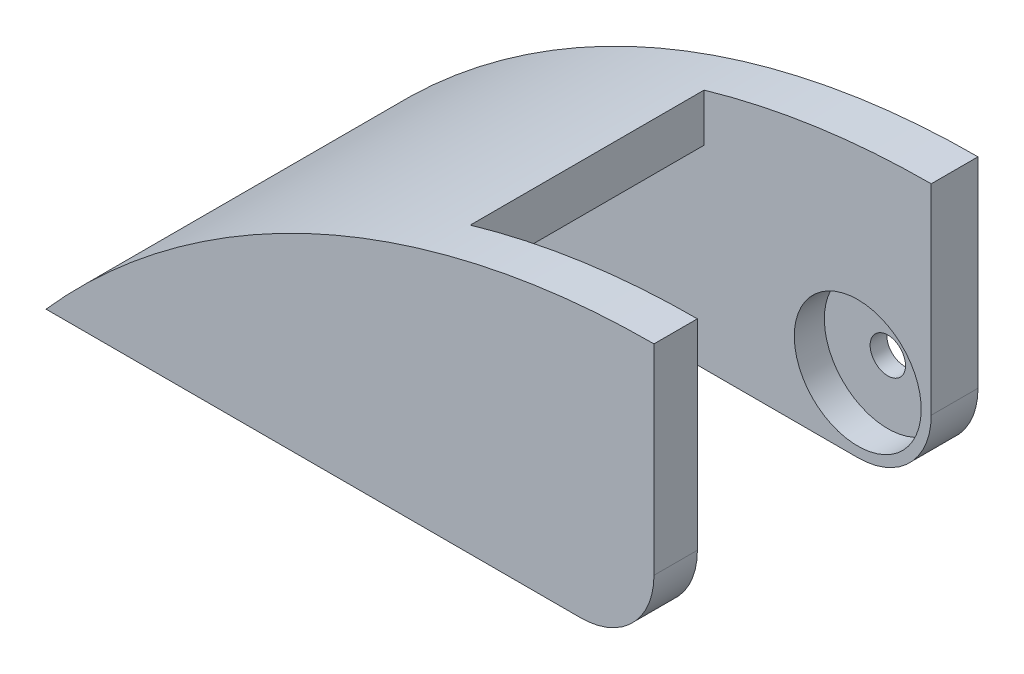
ISO-10303-21;
HEADER;
FILE_DESCRIPTION(('STEP AP214'),'2;1');
FILE_NAME('part.step','',(''),(''),'','','');
FILE_SCHEMA(('AUTOMOTIVE_DESIGN { 1 0 10303 214 1 1 1 1 }'));
ENDSEC;
DATA;
#1=APPLICATION_CONTEXT('core data for automotive mechanical design processes');
#2=APPLICATION_PROTOCOL_DEFINITION('international standard','automotive_design',2000,#1);
#3=PRODUCT_CONTEXT('',#1,'mechanical');
#4=PRODUCT('Part','Part','',(#3));
#5=PRODUCT_RELATED_PRODUCT_CATEGORY('part','',(#4));
#6=PRODUCT_DEFINITION_FORMATION('','',#4);
#7=PRODUCT_DEFINITION_CONTEXT('part definition',#1,'design');
#8=PRODUCT_DEFINITION('design','',#6,#7);
#9=PRODUCT_DEFINITION_SHAPE('','',#8);
#10=(LENGTH_UNIT() NAMED_UNIT(*) SI_UNIT(.MILLI.,.METRE.));
#11=(NAMED_UNIT(*) PLANE_ANGLE_UNIT() SI_UNIT($,.RADIAN.));
#12=(NAMED_UNIT(*) SI_UNIT($,.STERADIAN.) SOLID_ANGLE_UNIT());
#13=UNCERTAINTY_MEASURE_WITH_UNIT(LENGTH_MEASURE(1.E-05),#10,'distance_accuracy_value','');
#14=(GEOMETRIC_REPRESENTATION_CONTEXT(3) GLOBAL_UNCERTAINTY_ASSIGNED_CONTEXT((#13)) GLOBAL_UNIT_ASSIGNED_CONTEXT((#10,
#11,#12)) REPRESENTATION_CONTEXT('',''));
#15=CARTESIAN_POINT('',(0.,0.,0.));
#16=DIRECTION('',(0.,0.,1.));
#17=DIRECTION('',(1.,0.,0.));
#18=AXIS2_PLACEMENT_3D('',#15,#16,#17);
#19=CARTESIAN_POINT('',(0.,0.,-48.5));
#20=DIRECTION('',(0.,0.,-1.));
#21=DIRECTION('',(1.,0.,0.));
#22=AXIS2_PLACEMENT_3D('',#19,#20,#21);
#23=CYLINDRICAL_SURFACE('',#22,11.);
#24=DIRECTION('',(0.,0.,-1.));
#25=VECTOR('',#24,1.);
#26=CARTESIAN_POINT('',(11.,0.,-48.5));
#27=LINE('',#26,#25);
#28=CARTESIAN_POINT('',(11.,0.,-48.5));
#29=VERTEX_POINT('',#28);
#30=CARTESIAN_POINT('',(11.,0.,-55.));
#31=VERTEX_POINT('',#30);
#32=EDGE_CURVE('E161',#29,#31,#27,.T.);
#33=ORIENTED_EDGE('',*,*,#32,.F.);
#34=CARTESIAN_POINT('',(0.,0.,-48.5));
#35=DIRECTION('',(0.,0.,1.));
#36=DIRECTION('',(1.,0.,0.));
#37=AXIS2_PLACEMENT_3D('',#34,#35,#36);
#38=CIRCLE('',#37,11.);
#39=CARTESIAN_POINT('',(0.,-11.,-48.5));
#40=VERTEX_POINT('',#39);
#41=EDGE_CURVE('E233',#40,#29,#38,.T.);
#42=ORIENTED_EDGE('',*,*,#41,.F.);
#43=DIRECTION('',(0.,0.,1.));
#44=VECTOR('',#43,1.);
#45=CARTESIAN_POINT('',(0.,-11.,-55.5));
#46=LINE('',#45,#44);
#47=CARTESIAN_POINT('',(0.,-11.,-55.));
#48=VERTEX_POINT('',#47);
#49=EDGE_CURVE('E205',#48,#40,#46,.T.);
#50=ORIENTED_EDGE('',*,*,#49,.F.);
#51=CARTESIAN_POINT('',(0.,0.,-55.));
#52=DIRECTION('',(0.,0.,1.));
#53=DIRECTION('',(1.,0.,0.));
#54=AXIS2_PLACEMENT_3D('',#51,#52,#53);
#55=CIRCLE('',#54,11.);
#56=EDGE_CURVE('E177',#48,#31,#55,.T.);
#57=ORIENTED_EDGE('',*,*,#56,.T.);
#58=EDGE_LOOP('',(#33,#42,#50,#57));
#59=FACE_BOUND('',#58,.T.);
#60=ADVANCED_FACE('F49',(#59),#23,.T.);
#61=CARTESIAN_POINT('',(11.,0.,-48.5));
#62=DIRECTION('',(-1.,0.,0.));
#63=DIRECTION('',(0.,0.,-1.));
#64=AXIS2_PLACEMENT_3D('',#61,#62,#63);
#65=PLANE('',#64);
#66=DIRECTION('',(0.,1.,0.));
#67=VECTOR('',#66,1.);
#68=CARTESIAN_POINT('',(11.,0.,-55.));
#69=LINE('',#68,#67);
#70=CARTESIAN_POINT('',(11.,30.,-55.));
#71=VERTEX_POINT('',#70);
#72=EDGE_CURVE('E140',#31,#71,#69,.T.);
#73=ORIENTED_EDGE('',*,*,#72,.T.);
#74=DIRECTION('',(0.,0.,-1.));
#75=VECTOR('',#74,1.);
#76=CARTESIAN_POINT('',(11.,30.,-48.5));
#77=LINE('',#76,#75);
#78=CARTESIAN_POINT('',(11.,30.,-48.5));
#79=VERTEX_POINT('',#78);
#80=EDGE_CURVE('E149',#79,#71,#77,.T.);
#81=ORIENTED_EDGE('',*,*,#80,.F.);
#82=DIRECTION('',(0.,-1.,0.));
#83=VECTOR('',#82,1.);
#84=CARTESIAN_POINT('',(11.,0.,-48.5));
#85=LINE('',#84,#83);
#86=EDGE_CURVE('E230',#79,#29,#85,.T.);
#87=ORIENTED_EDGE('',*,*,#86,.T.);
#88=ORIENTED_EDGE('',*,*,#32,.T.);
#89=EDGE_LOOP('',(#73,#81,#87,#88));
#90=FACE_BOUND('',#89,.T.);
#91=ADVANCED_FACE('F159',(#90),#65,.F.);
#92=CARTESIAN_POINT('',(12.,-12.,-90.));
#93=DIRECTION('',(0.,0.,-1.));
#94=DIRECTION('',(0.,-1.,0.));
#95=AXIS2_PLACEMENT_3D('',#92,#93,#94);
#96=PLANE('',#95);
#97=CARTESIAN_POINT('',(0.,0.,-90.));
#98=DIRECTION('',(0.,0.,-1.));
#99=DIRECTION('',(0.,1.,0.));
#100=AXIS2_PLACEMENT_3D('',#97,#98,#99);
#101=CIRCLE('',#100,9.5);
#102=CARTESIAN_POINT('',(0.,9.5,-90.));
#103=VERTEX_POINT('',#102);
#104=EDGE_CURVE('E58',#103,#103,#101,.T.);
#105=ORIENTED_EDGE('',*,*,#104,.T.);
#106=EDGE_LOOP('',(#105));
#107=FACE_BOUND('',#106,.T.);
#108=CARTESIAN_POINT('',(11.,-91.4878048780488,-90.));
#109=DIRECTION('',(0.,0.,1.));
#110=DIRECTION('',(0.,-1.,0.));
#111=AXIS2_PLACEMENT_3D('',#108,#109,#110);
#112=CIRCLE('',#111,118.487804878049);
#113=CARTESIAN_POINT('',(-34.2965836217796,18.,-90.));
#114=VERTEX_POINT('',#113);
#115=CARTESIAN_POINT('',(-75.954431576152,-11.,-90.));
#116=VERTEX_POINT('',#115);
#117=EDGE_CURVE('E190',#114,#116,#112,.T.);
#118=ORIENTED_EDGE('',*,*,#117,.T.);
#119=DIRECTION('',(-1.,0.,0.));
#120=VECTOR('',#119,1.);
#121=CARTESIAN_POINT('',(0.,-11.,-90.));
#122=LINE('',#121,#120);
#123=CARTESIAN_POINT('',(0.,-11.,-90.));
#124=VERTEX_POINT('',#123);
#125=EDGE_CURVE('E209',#124,#116,#122,.T.);
#126=ORIENTED_EDGE('',*,*,#125,.F.);
#127=CARTESIAN_POINT('',(0.,0.,-90.));
#128=DIRECTION('',(0.,0.,1.));
#129=DIRECTION('',(0.,-1.,0.));
#130=AXIS2_PLACEMENT_3D('',#127,#128,#129);
#131=CIRCLE('',#130,11.);
#132=CARTESIAN_POINT('',(11.,0.,-90.));
#133=VERTEX_POINT('',#132);
#134=EDGE_CURVE('E155',#124,#133,#131,.T.);
#135=ORIENTED_EDGE('',*,*,#134,.T.);
#136=DIRECTION('',(0.,-1.,0.));
#137=VECTOR('',#136,1.);
#138=CARTESIAN_POINT('',(11.,-12.,-90.));
#139=LINE('',#138,#137);
#140=CARTESIAN_POINT('',(11.,30.,-90.));
#141=VERTEX_POINT('',#140);
#142=EDGE_CURVE('E248',#141,#133,#139,.T.);
#143=ORIENTED_EDGE('',*,*,#142,.F.);
#144=CARTESIAN_POINT('',(11.0000000000003,-91.4878048780494,-90.));
#145=DIRECTION('',(0.,0.,1.));
#146=DIRECTION('',(0.,-1.,0.));
#147=AXIS2_PLACEMENT_3D('',#144,#145,#146);
#148=CIRCLE('',#147,121.487804878049);
#149=CARTESIAN_POINT('',(-23.,25.1453239237065,-90.));
#150=VERTEX_POINT('',#149);
#151=EDGE_CURVE('E197',#150,#141,#148,.F.);
#152=ORIENTED_EDGE('',*,*,#151,.F.);
#153=DIRECTION('',(0.,1.,0.));
#154=VECTOR('',#153,1.);
#155=CARTESIAN_POINT('',(-23.,15.5,-90.));
#156=LINE('',#155,#154);
#157=CARTESIAN_POINT('',(-23.,18.,-90.));
#158=VERTEX_POINT('',#157);
#159=EDGE_CURVE('E252',#158,#150,#156,.T.);
#160=ORIENTED_EDGE('',*,*,#159,.F.);
#161=DIRECTION('',(1.,0.,0.));
#162=VECTOR('',#161,1.);
#163=CARTESIAN_POINT('',(0.,18.,-90.));
#164=LINE('',#163,#162);
#165=EDGE_CURVE('E213',#114,#158,#164,.T.);
#166=ORIENTED_EDGE('',*,*,#165,.F.);
#167=EDGE_LOOP('',(#118,#126,#135,#143,#152,#160,#166));
#168=FACE_BOUND('',#167,.T.);
#169=ADVANCED_FACE('F297',(#107,#168),#96,.F.);
#170=CARTESIAN_POINT('',(12.,18.,-90.));
#171=DIRECTION('',(0.,1.,0.));
#172=DIRECTION('',(0.,0.,-1.));
#173=AXIS2_PLACEMENT_3D('',#170,#171,#172);
#174=PLANE('',#173);
#175=DIRECTION('',(0.,0.,-1.));
#176=VECTOR('',#175,1.);
#177=CARTESIAN_POINT('',(-34.2965836217796,18.,-55.5));
#178=LINE('',#177,#176);
#179=CARTESIAN_POINT('',(-34.2965836217796,18.,-55.));
#180=VERTEX_POINT('',#179);
#181=EDGE_CURVE('E187',#180,#114,#178,.T.);
#182=ORIENTED_EDGE('',*,*,#181,.T.);
#183=ORIENTED_EDGE('',*,*,#165,.T.);
#184=DIRECTION('',(0.,0.,-1.));
#185=VECTOR('',#184,1.);
#186=CARTESIAN_POINT('',(-23.,18.,-90.));
#187=LINE('',#186,#185);
#188=CARTESIAN_POINT('',(-23.,18.,-55.));
#189=VERTEX_POINT('',#188);
#190=EDGE_CURVE('E11',#189,#158,#187,.T.);
#191=ORIENTED_EDGE('',*,*,#190,.F.);
#192=DIRECTION('',(-1.,0.,0.));
#193=VECTOR('',#192,1.);
#194=CARTESIAN_POINT('',(0.,18.,-55.));
#195=LINE('',#194,#193);
#196=EDGE_CURVE('E167',#189,#180,#195,.T.);
#197=ORIENTED_EDGE('',*,*,#196,.T.);
#198=EDGE_LOOP('',(#182,#183,#191,#197));
#199=FACE_BOUND('',#198,.T.);
#200=ADVANCED_FACE('F320',(#199),#174,.F.);
#201=CARTESIAN_POINT('',(0.,0.,-97.));
#202=DIRECTION('',(0.,0.,-1.));
#203=DIRECTION('',(1.,0.,0.));
#204=AXIS2_PLACEMENT_3D('',#201,#202,#203);
#205=PLANE('',#204);
#206=CARTESIAN_POINT('',(11.,-91.4878048780488,-97.));
#207=DIRECTION('',(0.,0.,1.));
#208=DIRECTION('',(1.,0.,0.));
#209=AXIS2_PLACEMENT_3D('',#206,#207,#208);
#210=CIRCLE('',#209,121.487804878049);
#211=CARTESIAN_POINT('',(-80.,-11.,-97.));
#212=VERTEX_POINT('',#211);
#213=CARTESIAN_POINT('',(11.,30.,-97.));
#214=VERTEX_POINT('',#213);
#215=EDGE_CURVE('E208',#212,#214,#210,.F.);
#216=ORIENTED_EDGE('',*,*,#215,.T.);
#217=DIRECTION('',(0.,-1.,0.));
#218=VECTOR('',#217,1.);
#219=CARTESIAN_POINT('',(11.,0.,-97.));
#220=LINE('',#219,#218);
#221=CARTESIAN_POINT('',(11.,0.,-97.));
#222=VERTEX_POINT('',#221);
#223=EDGE_CURVE('E227',#214,#222,#220,.T.);
#224=ORIENTED_EDGE('',*,*,#223,.T.);
#225=CARTESIAN_POINT('',(0.,0.,-97.));
#226=DIRECTION('',(0.,0.,1.));
#227=DIRECTION('',(1.,0.,0.));
#228=AXIS2_PLACEMENT_3D('',#225,#226,#227);
#229=CIRCLE('',#228,11.);
#230=CARTESIAN_POINT('',(0.,-11.,-97.));
#231=VERTEX_POINT('',#230);
#232=EDGE_CURVE('E234',#231,#222,#229,.T.);
#233=ORIENTED_EDGE('',*,*,#232,.F.);
#234=DIRECTION('',(-1.,0.,0.));
#235=VECTOR('',#234,1.);
#236=CARTESIAN_POINT('',(0.,-11.,-97.));
#237=LINE('',#236,#235);
#238=EDGE_CURVE('E214',#231,#212,#237,.T.);
#239=ORIENTED_EDGE('',*,*,#238,.T.);
#240=EDGE_LOOP('',(#216,#224,#233,#239));
#241=FACE_BOUND('',#240,.T.);
#242=CARTESIAN_POINT('',(0.,0.,-97.));
#243=DIRECTION('',(0.,0.,1.));
#244=DIRECTION('',(1.,0.,0.));
#245=AXIS2_PLACEMENT_3D('',#242,#243,#244);
#246=CIRCLE('',#245,2.65);
#247=CARTESIAN_POINT('',(2.65,0.,-97.));
#248=VERTEX_POINT('',#247);
#249=EDGE_CURVE('E260',#248,#248,#246,.T.);
#250=ORIENTED_EDGE('',*,*,#249,.T.);
#251=EDGE_LOOP('',(#250));
#252=FACE_BOUND('',#251,.T.);
#253=ADVANCED_FACE('F305',(#241,#252),#205,.T.);
#254=CARTESIAN_POINT('',(0.,0.,-48.5));
#255=DIRECTION('',(0.,0.,1.));
#256=DIRECTION('',(-1.,0.,0.));
#257=AXIS2_PLACEMENT_3D('',#254,#255,#256);
#258=PLANE('',#257);
#259=CARTESIAN_POINT('',(11.,-91.4878048780488,-48.5));
#260=DIRECTION('',(0.,0.,1.));
#261=DIRECTION('',(1.,0.,0.));
#262=AXIS2_PLACEMENT_3D('',#259,#260,#261);
#263=CIRCLE('',#262,121.487804878049);
#264=CARTESIAN_POINT('',(-80.,-11.,-48.5));
#265=VERTEX_POINT('',#264);
#266=EDGE_CURVE('E151',#265,#79,#263,.F.);
#267=ORIENTED_EDGE('',*,*,#266,.F.);
#268=DIRECTION('',(-1.,0.,0.));
#269=VECTOR('',#268,1.);
#270=CARTESIAN_POINT('',(0.,-11.,-48.5));
#271=LINE('',#270,#269);
#272=EDGE_CURVE('E65',#40,#265,#271,.T.);
#273=ORIENTED_EDGE('',*,*,#272,.F.);
#274=ORIENTED_EDGE('',*,*,#41,.T.);
#275=ORIENTED_EDGE('',*,*,#86,.F.);
#276=EDGE_LOOP('',(#267,#273,#274,#275));
#277=FACE_BOUND('',#276,.T.);
#278=ADVANCED_FACE('F289',(#277),#258,.T.);
#279=ORIENTED_EDGE('',*,*,#232,.T.);
#280=EDGE_CURVE('E237',#133,#222,#27,.T.);
#281=ORIENTED_EDGE('',*,*,#280,.F.);
#282=ORIENTED_EDGE('',*,*,#134,.F.);
#283=DIRECTION('',(0.,0.,-1.));
#284=VECTOR('',#283,1.);
#285=CARTESIAN_POINT('',(0.,-11.,-90.));
#286=LINE('',#285,#284);
#287=EDGE_CURVE('E73',#124,#231,#286,.T.);
#288=ORIENTED_EDGE('',*,*,#287,.T.);
#289=EDGE_LOOP('',(#279,#281,#282,#288));
#290=FACE_BOUND('',#289,.T.);
#291=ADVANCED_FACE('F284',(#290),#23,.T.);
#292=CARTESIAN_POINT('',(0.,0.,-49.));
#293=DIRECTION('',(0.,0.,-1.));
#294=DIRECTION('',(1.,0.,0.));
#295=AXIS2_PLACEMENT_3D('',#292,#293,#294);
#296=CYLINDRICAL_SURFACE('',#295,2.65);
#297=ORIENTED_EDGE('',*,*,#249,.F.);
#298=EDGE_LOOP('',(#297));
#299=FACE_BOUND('',#298,.T.);
#300=CARTESIAN_POINT('',(0.,0.,-94.5));
#301=DIRECTION('',(0.,0.,-1.));
#302=DIRECTION('',(0.,1.,0.));
#303=AXIS2_PLACEMENT_3D('',#300,#301,#302);
#304=CIRCLE('',#303,2.65);
#305=CARTESIAN_POINT('',(0.,2.65,-94.5));
#306=VERTEX_POINT('',#305);
#307=EDGE_CURVE('E261',#306,#306,#304,.F.);
#308=ORIENTED_EDGE('',*,*,#307,.T.);
#309=EDGE_LOOP('',(#308));
#310=FACE_BOUND('',#309,.T.);
#311=ADVANCED_FACE('F51',(#299,#310),#296,.F.);
#312=CARTESIAN_POINT('',(0.,0.,-94.5));
#313=DIRECTION('',(0.,0.,1.));
#314=DIRECTION('',(0.,1.,0.));
#315=AXIS2_PLACEMENT_3D('',#312,#313,#314);
#316=PLANE('',#315);
#317=CARTESIAN_POINT('',(0.,0.,-94.5));
#318=DIRECTION('',(0.,0.,-1.));
#319=DIRECTION('',(0.,1.,0.));
#320=AXIS2_PLACEMENT_3D('',#317,#318,#319);
#321=CIRCLE('',#320,9.5);
#322=CARTESIAN_POINT('',(0.,9.5,-94.5));
#323=VERTEX_POINT('',#322);
#324=EDGE_CURVE('E265',#323,#323,#321,.T.);
#325=ORIENTED_EDGE('',*,*,#324,.F.);
#326=EDGE_LOOP('',(#325));
#327=FACE_BOUND('',#326,.T.);
#328=ORIENTED_EDGE('',*,*,#307,.F.);
#329=EDGE_LOOP('',(#328));
#330=FACE_BOUND('',#329,.T.);
#331=ADVANCED_FACE('F278',(#327,#330),#316,.T.);
#332=CARTESIAN_POINT('',(0.,0.,-94.5));
#333=DIRECTION('',(0.,0.,1.));
#334=DIRECTION('',(0.,1.,0.));
#335=AXIS2_PLACEMENT_3D('',#332,#333,#334);
#336=CYLINDRICAL_SURFACE('',#335,9.5);
#337=ORIENTED_EDGE('',*,*,#324,.T.);
#338=EDGE_LOOP('',(#337));
#339=FACE_BOUND('',#338,.T.);
#340=ORIENTED_EDGE('',*,*,#104,.F.);
#341=EDGE_LOOP('',(#340));
#342=FACE_BOUND('',#341,.T.);
#343=ADVANCED_FACE('F275',(#339,#342),#336,.F.);
#344=CARTESIAN_POINT('',(-23.,15.5,-56.));
#345=DIRECTION('',(-1.,0.,0.));
#346=DIRECTION('',(0.,0.,-1.));
#347=AXIS2_PLACEMENT_3D('',#344,#345,#346);
#348=PLANE('',#347);
#349=DIRECTION('',(0.,0.,-1.));
#350=VECTOR('',#349,1.);
#351=CARTESIAN_POINT('',(-23.,25.1453239237065,-48.5));
#352=LINE('',#351,#350);
#353=CARTESIAN_POINT('',(-23.,25.1453239237065,-55.));
#354=VERTEX_POINT('',#353);
#355=EDGE_CURVE('E194',#354,#150,#352,.T.);
#356=ORIENTED_EDGE('',*,*,#355,.F.);
#357=DIRECTION('',(0.,-1.,0.));
#358=VECTOR('',#357,1.);
#359=CARTESIAN_POINT('',(-23.,0.,-55.));
#360=LINE('',#359,#358);
#361=EDGE_CURVE('E143',#354,#189,#360,.T.);
#362=ORIENTED_EDGE('',*,*,#361,.T.);
#363=ORIENTED_EDGE('',*,*,#190,.T.);
#364=ORIENTED_EDGE('',*,*,#159,.T.);
#365=EDGE_LOOP('',(#356,#362,#363,#364));
#366=FACE_BOUND('',#365,.T.);
#367=ADVANCED_FACE('F306',(#366),#348,.F.);
#368=EDGE_CURVE('E156',#141,#214,#77,.T.);
#369=ORIENTED_EDGE('',*,*,#368,.F.);
#370=ORIENTED_EDGE('',*,*,#142,.T.);
#371=ORIENTED_EDGE('',*,*,#280,.T.);
#372=ORIENTED_EDGE('',*,*,#223,.F.);
#373=EDGE_LOOP('',(#369,#370,#371,#372));
#374=FACE_BOUND('',#373,.T.);
#375=ADVANCED_FACE('F299',(#374),#65,.F.);
#376=CARTESIAN_POINT('',(11.,-91.4878048780488,-90.));
#377=DIRECTION('',(0.,0.,-1.));
#378=DIRECTION('',(1.,0.,0.));
#379=AXIS2_PLACEMENT_3D('',#376,#377,#378);
#380=CYLINDRICAL_SURFACE('',#379,121.487804878049);
#381=ORIENTED_EDGE('',*,*,#355,.T.);
#382=ORIENTED_EDGE('',*,*,#151,.T.);
#383=ORIENTED_EDGE('',*,*,#368,.T.);
#384=ORIENTED_EDGE('',*,*,#215,.F.);
#385=DIRECTION('',(0.,0.,-1.));
#386=VECTOR('',#385,1.);
#387=CARTESIAN_POINT('',(-80.,-11.,-90.));
#388=LINE('',#387,#386);
#389=EDGE_CURVE('E218',#265,#212,#388,.T.);
#390=ORIENTED_EDGE('',*,*,#389,.F.);
#391=ORIENTED_EDGE('',*,*,#266,.T.);
#392=ORIENTED_EDGE('',*,*,#80,.T.);
#393=CARTESIAN_POINT('',(11.0000000000003,-91.4878048780494,-55.));
#394=DIRECTION('',(0.,0.,1.));
#395=DIRECTION('',(1.,0.,0.));
#396=AXIS2_PLACEMENT_3D('',#393,#394,#395);
#397=CIRCLE('',#396,121.487804878049);
#398=EDGE_CURVE('E134',#71,#354,#397,.T.);
#399=ORIENTED_EDGE('',*,*,#398,.T.);
#400=EDGE_LOOP('',(#381,#382,#383,#384,#390,#391,#392,#399));
#401=FACE_BOUND('',#400,.T.);
#402=ADVANCED_FACE('F150',(#401),#380,.T.);
#403=CARTESIAN_POINT('',(0.,-11.,-90.));
#404=DIRECTION('',(0.,1.,0.));
#405=DIRECTION('',(-1.,0.,0.));
#406=AXIS2_PLACEMENT_3D('',#403,#404,#405);
#407=PLANE('',#406);
#408=DIRECTION('',(1.,0.,0.));
#409=VECTOR('',#408,1.);
#410=CARTESIAN_POINT('',(0.,-11.,-55.));
#411=LINE('',#410,#409);
#412=CARTESIAN_POINT('',(-75.954431576152,-11.,-55.));
#413=VERTEX_POINT('',#412);
#414=EDGE_CURVE('E174',#413,#48,#411,.T.);
#415=ORIENTED_EDGE('',*,*,#414,.T.);
#416=ORIENTED_EDGE('',*,*,#49,.T.);
#417=ORIENTED_EDGE('',*,*,#272,.T.);
#418=ORIENTED_EDGE('',*,*,#389,.T.);
#419=ORIENTED_EDGE('',*,*,#238,.F.);
#420=ORIENTED_EDGE('',*,*,#287,.F.);
#421=ORIENTED_EDGE('',*,*,#125,.T.);
#422=DIRECTION('',(0.,0.,-1.));
#423=VECTOR('',#422,1.);
#424=CARTESIAN_POINT('',(-75.954431576152,-11.,-55.5));
#425=LINE('',#424,#423);
#426=EDGE_CURVE('E184',#413,#116,#425,.T.);
#427=ORIENTED_EDGE('',*,*,#426,.F.);
#428=EDGE_LOOP('',(#415,#416,#417,#418,#419,#420,#421,#427));
#429=FACE_BOUND('',#428,.T.);
#430=ADVANCED_FACE('F354',(#429),#407,.F.);
#431=CARTESIAN_POINT('',(11.,-91.4878048780488,-55.5));
#432=DIRECTION('',(0.,0.,-1.));
#433=DIRECTION('',(1.,0.,0.));
#434=AXIS2_PLACEMENT_3D('',#431,#432,#433);
#435=CYLINDRICAL_SURFACE('',#434,118.487804878049);
#436=ORIENTED_EDGE('',*,*,#181,.F.);
#437=CARTESIAN_POINT('',(11.,-91.4878048780488,-55.));
#438=DIRECTION('',(0.,0.,1.));
#439=DIRECTION('',(1.,0.,0.));
#440=AXIS2_PLACEMENT_3D('',#437,#438,#439);
#441=CIRCLE('',#440,118.487804878049);
#442=EDGE_CURVE('E171',#180,#413,#441,.T.);
#443=ORIENTED_EDGE('',*,*,#442,.T.);
#444=ORIENTED_EDGE('',*,*,#426,.T.);
#445=ORIENTED_EDGE('',*,*,#117,.F.);
#446=EDGE_LOOP('',(#436,#443,#444,#445));
#447=FACE_BOUND('',#446,.T.);
#448=ADVANCED_FACE('F362',(#447),#435,.F.);
#449=CARTESIAN_POINT('',(0.,0.,-55.));
#450=DIRECTION('',(0.,0.,-1.));
#451=DIRECTION('',(1.,0.,0.));
#452=AXIS2_PLACEMENT_3D('',#449,#450,#451);
#453=PLANE('',#452);
#454=ORIENTED_EDGE('',*,*,#72,.F.);
#455=ORIENTED_EDGE('',*,*,#56,.F.);
#456=ORIENTED_EDGE('',*,*,#414,.F.);
#457=ORIENTED_EDGE('',*,*,#442,.F.);
#458=ORIENTED_EDGE('',*,*,#196,.F.);
#459=ORIENTED_EDGE('',*,*,#361,.F.);
#460=ORIENTED_EDGE('',*,*,#398,.F.);
#461=EDGE_LOOP('',(#454,#455,#456,#457,#458,#459,#460));
#462=FACE_BOUND('',#461,.T.);
#463=CARTESIAN_POINT('',(0.,0.,-55.));
#464=DIRECTION('',(0.,0.,1.));
#465=DIRECTION('',(1.,0.,0.));
#466=AXIS2_PLACEMENT_3D('',#463,#464,#465);
#467=CIRCLE('',#466,4.2);
#468=CARTESIAN_POINT('',(4.2,0.,-55.));
#469=VERTEX_POINT('',#468);
#470=EDGE_CURVE('E180',#469,#469,#467,.F.);
#471=ORIENTED_EDGE('',*,*,#470,.F.);
#472=EDGE_LOOP('',(#471));
#473=FACE_BOUND('',#472,.T.);
#474=ADVANCED_FACE('F136',(#462,#473),#453,.T.);
#475=CARTESIAN_POINT('',(0.,0.,-59.5));
#476=DIRECTION('',(0.,0.,-1.));
#477=DIRECTION('',(1.,0.,0.));
#478=AXIS2_PLACEMENT_3D('',#475,#476,#477);
#479=PLANE('',#478);
#480=CARTESIAN_POINT('',(0.,0.,-59.5));
#481=DIRECTION('',(0.,0.,1.));
#482=DIRECTION('',(1.,0.,0.));
#483=AXIS2_PLACEMENT_3D('',#480,#481,#482);
#484=CIRCLE('',#483,4.2);
#485=CARTESIAN_POINT('',(4.2,0.,-59.5));
#486=VERTEX_POINT('',#485);
#487=EDGE_CURVE('E256',#486,#486,#484,.T.);
#488=ORIENTED_EDGE('',*,*,#487,.F.);
#489=EDGE_LOOP('',(#488));
#490=FACE_BOUND('',#489,.T.);
#491=ADVANCED_FACE('F310',(#490),#479,.T.);
#492=CARTESIAN_POINT('',(0.,0.,-59.5));
#493=DIRECTION('',(0.,0.,1.));
#494=DIRECTION('',(-1.,0.,0.));
#495=AXIS2_PLACEMENT_3D('',#492,#493,#494);
#496=CYLINDRICAL_SURFACE('',#495,4.2);
#497=ORIENTED_EDGE('',*,*,#487,.T.);
#498=EDGE_LOOP('',(#497));
#499=FACE_BOUND('',#498,.T.);
#500=ORIENTED_EDGE('',*,*,#470,.T.);
#501=EDGE_LOOP('',(#500));
#502=FACE_BOUND('',#501,.T.);
#503=ADVANCED_FACE('F313',(#499,#502),#496,.T.);
#504=CLOSED_SHELL('',(#60,#91,#169,#200,#253,#278,#291,#311,#331,#343,#367,#375,#402,#430,#448,
#474,#491,#503));
#505=MANIFOLD_SOLID_BREP('B2',#504);
#506=ADVANCED_BREP_SHAPE_REPRESENTATION('',(#18,#505),#14);
#507=SHAPE_DEFINITION_REPRESENTATION(#9,#506);
ENDSEC;
END-ISO-10303-21;
